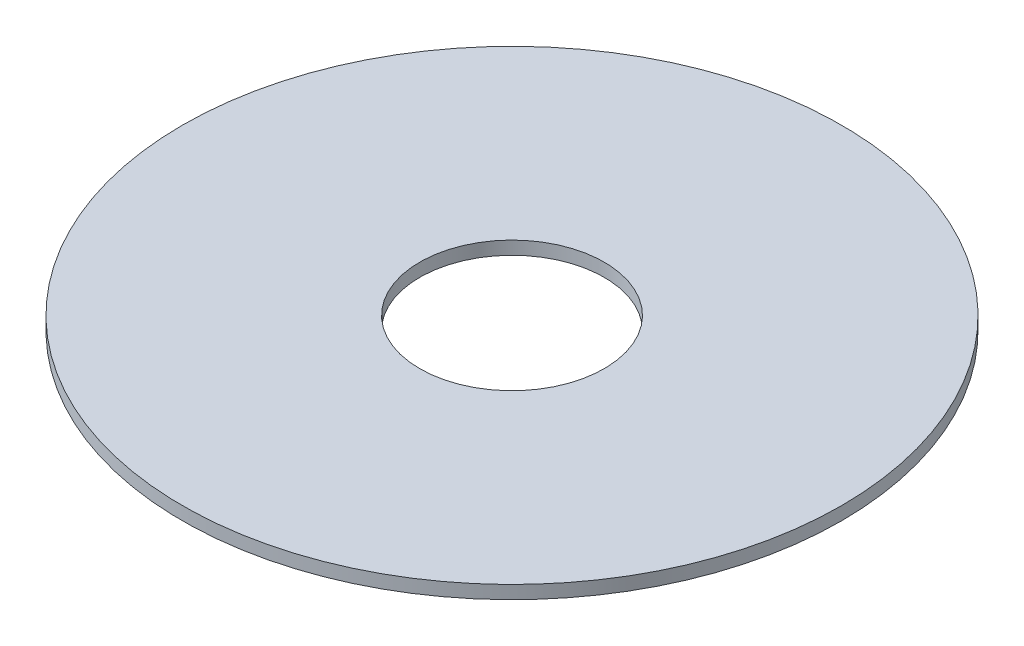
ISO-10303-21;
HEADER;
FILE_DESCRIPTION(('STEP AP214'),'2;1');
FILE_NAME('part.step','',(''),(''),'','','');
FILE_SCHEMA(('AUTOMOTIVE_DESIGN { 1 0 10303 214 1 1 1 1 }'));
ENDSEC;
DATA;
#1=APPLICATION_CONTEXT('core data for automotive mechanical design processes');
#2=APPLICATION_PROTOCOL_DEFINITION('international standard','automotive_design',2000,#1);
#3=PRODUCT_CONTEXT('',#1,'mechanical');
#4=PRODUCT('Part','Part','',(#3));
#5=PRODUCT_RELATED_PRODUCT_CATEGORY('part','',(#4));
#6=PRODUCT_DEFINITION_FORMATION('','',#4);
#7=PRODUCT_DEFINITION_CONTEXT('part definition',#1,'design');
#8=PRODUCT_DEFINITION('design','',#6,#7);
#9=PRODUCT_DEFINITION_SHAPE('','',#8);
#10=(LENGTH_UNIT() NAMED_UNIT(*) SI_UNIT(.MILLI.,.METRE.));
#11=(NAMED_UNIT(*) PLANE_ANGLE_UNIT() SI_UNIT($,.RADIAN.));
#12=(NAMED_UNIT(*) SI_UNIT($,.STERADIAN.) SOLID_ANGLE_UNIT());
#13=UNCERTAINTY_MEASURE_WITH_UNIT(LENGTH_MEASURE(1.E-05),#10,'distance_accuracy_value','');
#14=(GEOMETRIC_REPRESENTATION_CONTEXT(3) GLOBAL_UNCERTAINTY_ASSIGNED_CONTEXT((#13)) GLOBAL_UNIT_ASSIGNED_CONTEXT((#10,
#11,#12)) REPRESENTATION_CONTEXT('',''));
#15=CARTESIAN_POINT('',(0.,0.,0.));
#16=DIRECTION('',(0.,0.,1.));
#17=DIRECTION('',(1.,0.,0.));
#18=AXIS2_PLACEMENT_3D('',#15,#16,#17);
#19=CARTESIAN_POINT('',(0.,1.,0.));
#20=DIRECTION('',(0.,1.,0.));
#21=DIRECTION('',(0.,0.,1.));
#22=AXIS2_PLACEMENT_3D('',#19,#20,#21);
#23=PLANE('',#22);
#24=CARTESIAN_POINT('',(0.,1.,0.));
#25=DIRECTION('',(0.,1.,0.));
#26=DIRECTION('',(1.,0.,0.));
#27=AXIS2_PLACEMENT_3D('',#24,#25,#26);
#28=CIRCLE('',#27,25.);
#29=CARTESIAN_POINT('',(25.,1.,0.));
#30=VERTEX_POINT('',#29);
#31=EDGE_CURVE('E11',#30,#30,#28,.T.);
#32=ORIENTED_EDGE('',*,*,#31,.T.);
#33=EDGE_LOOP('',(#32));
#34=FACE_BOUND('',#33,.T.);
#35=CARTESIAN_POINT('',(0.,1.,0.));
#36=DIRECTION('',(0.,1.,0.));
#37=DIRECTION('',(0.,0.,1.));
#38=AXIS2_PLACEMENT_3D('',#35,#36,#37);
#39=CIRCLE('',#38,7.);
#40=CARTESIAN_POINT('',(0.,1.,7.));
#41=VERTEX_POINT('',#40);
#42=EDGE_CURVE('E50',#41,#41,#39,.T.);
#43=ORIENTED_EDGE('',*,*,#42,.F.);
#44=EDGE_LOOP('',(#43));
#45=FACE_BOUND('',#44,.T.);
#46=ADVANCED_FACE('F39',(#34,#45),#23,.T.);
#47=CARTESIAN_POINT('',(0.,0.,0.));
#48=DIRECTION('',(0.,1.,0.));
#49=DIRECTION('',(0.,0.,1.));
#50=AXIS2_PLACEMENT_3D('',#47,#48,#49);
#51=PLANE('',#50);
#52=CARTESIAN_POINT('',(0.,0.,0.));
#53=DIRECTION('',(0.,1.,0.));
#54=DIRECTION('',(1.,0.,0.));
#55=AXIS2_PLACEMENT_3D('',#52,#53,#54);
#56=CIRCLE('',#55,25.);
#57=CARTESIAN_POINT('',(25.,0.,0.));
#58=VERTEX_POINT('',#57);
#59=EDGE_CURVE('E43',#58,#58,#56,.T.);
#60=ORIENTED_EDGE('',*,*,#59,.F.);
#61=EDGE_LOOP('',(#60));
#62=FACE_BOUND('',#61,.T.);
#63=CARTESIAN_POINT('',(0.,0.,0.));
#64=DIRECTION('',(0.,1.,0.));
#65=DIRECTION('',(0.,0.,1.));
#66=AXIS2_PLACEMENT_3D('',#63,#64,#65);
#67=CIRCLE('',#66,7.);
#68=CARTESIAN_POINT('',(0.,0.,7.));
#69=VERTEX_POINT('',#68);
#70=EDGE_CURVE('E52',#69,#69,#67,.T.);
#71=ORIENTED_EDGE('',*,*,#70,.T.);
#72=EDGE_LOOP('',(#71));
#73=FACE_BOUND('',#72,.T.);
#74=ADVANCED_FACE('F62',(#62,#73),#51,.F.);
#75=CARTESIAN_POINT('',(0.,1.,0.));
#76=DIRECTION('',(0.,-1.,0.));
#77=DIRECTION('',(0.,0.,-1.));
#78=AXIS2_PLACEMENT_3D('',#75,#76,#77);
#79=CYLINDRICAL_SURFACE('',#78,25.);
#80=ORIENTED_EDGE('',*,*,#31,.F.);
#81=EDGE_LOOP('',(#80));
#82=FACE_BOUND('',#81,.T.);
#83=ORIENTED_EDGE('',*,*,#59,.T.);
#84=EDGE_LOOP('',(#83));
#85=FACE_BOUND('',#84,.T.);
#86=ADVANCED_FACE('F41',(#82,#85),#79,.T.);
#87=CARTESIAN_POINT('',(0.,1.,0.));
#88=DIRECTION('',(0.,-1.,0.));
#89=DIRECTION('',(0.,0.,-1.));
#90=AXIS2_PLACEMENT_3D('',#87,#88,#89);
#91=CYLINDRICAL_SURFACE('',#90,7.);
#92=ORIENTED_EDGE('',*,*,#42,.T.);
#93=EDGE_LOOP('',(#92));
#94=FACE_BOUND('',#93,.T.);
#95=ORIENTED_EDGE('',*,*,#70,.F.);
#96=EDGE_LOOP('',(#95));
#97=FACE_BOUND('',#96,.T.);
#98=ADVANCED_FACE('F58',(#94,#97),#91,.F.);
#99=CLOSED_SHELL('',(#46,#74,#86,#98));
#100=MANIFOLD_SOLID_BREP('B2',#99);
#101=ADVANCED_BREP_SHAPE_REPRESENTATION('',(#18,#100),#14);
#102=SHAPE_DEFINITION_REPRESENTATION(#9,#101);
ENDSEC;
END-ISO-10303-21;
